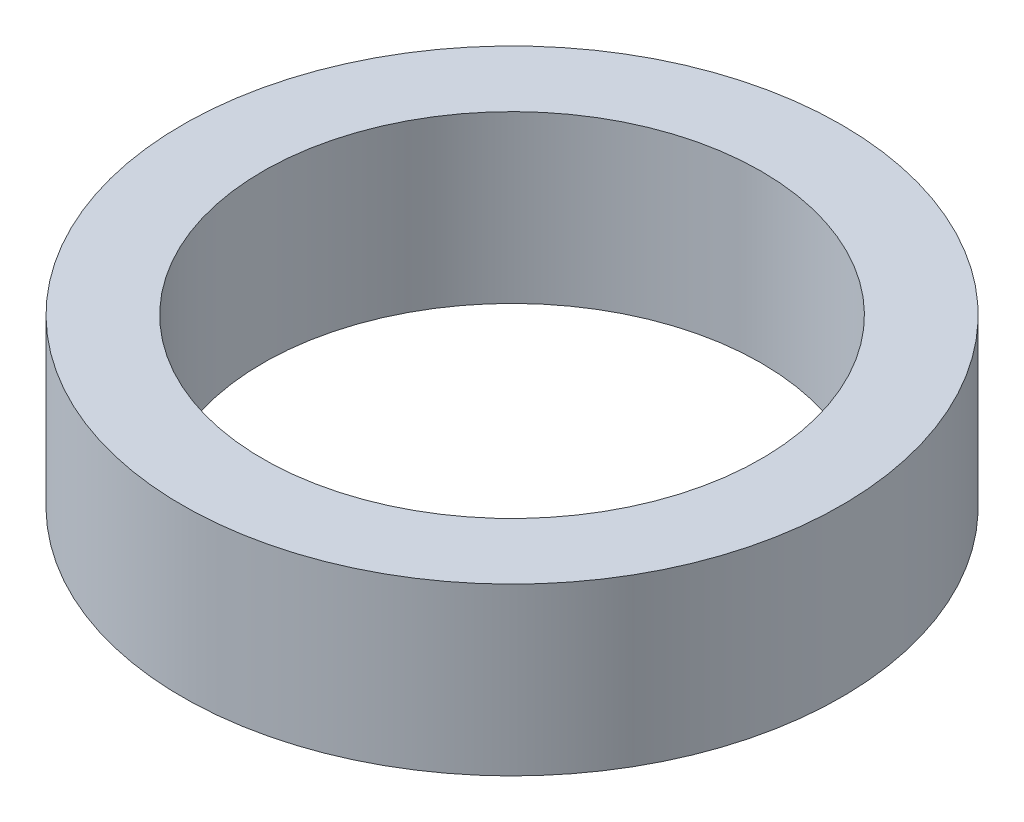
ISO-10303-21;
HEADER;
FILE_DESCRIPTION(('STEP AP214'),'2;1');
FILE_NAME('part.step','',(''),(''),'','','');
FILE_SCHEMA(('AUTOMOTIVE_DESIGN { 1 0 10303 214 1 1 1 1 }'));
ENDSEC;
DATA;
#1=APPLICATION_CONTEXT('core data for automotive mechanical design processes');
#2=APPLICATION_PROTOCOL_DEFINITION('international standard','automotive_design',2000,#1);
#3=PRODUCT_CONTEXT('',#1,'mechanical');
#4=PRODUCT('Part','Part','',(#3));
#5=PRODUCT_RELATED_PRODUCT_CATEGORY('part','',(#4));
#6=PRODUCT_DEFINITION_FORMATION('','',#4);
#7=PRODUCT_DEFINITION_CONTEXT('part definition',#1,'design');
#8=PRODUCT_DEFINITION('design','',#6,#7);
#9=PRODUCT_DEFINITION_SHAPE('','',#8);
#10=(LENGTH_UNIT() NAMED_UNIT(*) SI_UNIT(.MILLI.,.METRE.));
#11=(NAMED_UNIT(*) PLANE_ANGLE_UNIT() SI_UNIT($,.RADIAN.));
#12=(NAMED_UNIT(*) SI_UNIT($,.STERADIAN.) SOLID_ANGLE_UNIT());
#13=UNCERTAINTY_MEASURE_WITH_UNIT(LENGTH_MEASURE(1.E-05),#10,'distance_accuracy_value','');
#14=(GEOMETRIC_REPRESENTATION_CONTEXT(3) GLOBAL_UNCERTAINTY_ASSIGNED_CONTEXT((#13)) GLOBAL_UNIT_ASSIGNED_CONTEXT((#10,
#11,#12)) REPRESENTATION_CONTEXT('',''));
#15=CARTESIAN_POINT('',(0.,0.,0.));
#16=DIRECTION('',(0.,0.,1.));
#17=DIRECTION('',(1.,0.,0.));
#18=AXIS2_PLACEMENT_3D('',#15,#16,#17);
#19=CARTESIAN_POINT('',(-3.1496,1.5875,0.));
#20=DIRECTION('',(0.,-1.,0.));
#21=DIRECTION('',(0.,0.,-1.));
#22=AXIS2_PLACEMENT_3D('',#19,#20,#21);
#23=PLANE('',#22);
#24=CARTESIAN_POINT('',(0.,1.5875,0.));
#25=DIRECTION('',(0.,-1.,0.));
#26=DIRECTION('',(0.,0.,-1.));
#27=AXIS2_PLACEMENT_3D('',#24,#25,#26);
#28=CIRCLE('',#27,3.1496);
#29=CARTESIAN_POINT('',(0.,1.5875,-3.1496));
#30=VERTEX_POINT('',#29);
#31=EDGE_CURVE('E54',#30,#30,#28,.T.);
#32=ORIENTED_EDGE('',*,*,#31,.F.);
#33=EDGE_LOOP('',(#32));
#34=FACE_BOUND('',#33,.T.);
#35=CARTESIAN_POINT('',(0.,1.5875,0.));
#36=DIRECTION('',(0.,-1.,0.));
#37=DIRECTION('',(0.,0.,-1.));
#38=AXIS2_PLACEMENT_3D('',#35,#36,#37);
#39=CIRCLE('',#38,2.38125);
#40=CARTESIAN_POINT('',(0.,1.5875,-2.38125));
#41=VERTEX_POINT('',#40);
#42=EDGE_CURVE('E10',#41,#41,#39,.T.);
#43=ORIENTED_EDGE('',*,*,#42,.T.);
#44=EDGE_LOOP('',(#43));
#45=FACE_BOUND('',#44,.T.);
#46=ADVANCED_FACE('F37',(#34,#45),#23,.F.);
#47=CARTESIAN_POINT('',(0.,0.,0.));
#48=DIRECTION('',(0.,-1.,0.));
#49=DIRECTION('',(0.,0.,-1.));
#50=AXIS2_PLACEMENT_3D('',#47,#48,#49);
#51=CYLINDRICAL_SURFACE('',#50,2.38125);
#52=ORIENTED_EDGE('',*,*,#42,.F.);
#53=EDGE_LOOP('',(#52));
#54=FACE_BOUND('',#53,.T.);
#55=CARTESIAN_POINT('',(0.,0.,0.));
#56=DIRECTION('',(0.,-1.,0.));
#57=DIRECTION('',(0.,0.,-1.));
#58=AXIS2_PLACEMENT_3D('',#55,#56,#57);
#59=CIRCLE('',#58,2.38125);
#60=CARTESIAN_POINT('',(0.,0.,-2.38125));
#61=VERTEX_POINT('',#60);
#62=EDGE_CURVE('E44',#61,#61,#59,.T.);
#63=ORIENTED_EDGE('',*,*,#62,.T.);
#64=EDGE_LOOP('',(#63));
#65=FACE_BOUND('',#64,.T.);
#66=ADVANCED_FACE('F64',(#54,#65),#51,.F.);
#67=CARTESIAN_POINT('',(-2.38125,0.,0.));
#68=DIRECTION('',(0.,1.,0.));
#69=DIRECTION('',(0.,0.,1.));
#70=AXIS2_PLACEMENT_3D('',#67,#68,#69);
#71=PLANE('',#70);
#72=ORIENTED_EDGE('',*,*,#62,.F.);
#73=EDGE_LOOP('',(#72));
#74=FACE_BOUND('',#73,.T.);
#75=CARTESIAN_POINT('',(0.,0.,0.));
#76=DIRECTION('',(0.,-1.,0.));
#77=DIRECTION('',(0.,0.,-1.));
#78=AXIS2_PLACEMENT_3D('',#75,#76,#77);
#79=CIRCLE('',#78,3.1496);
#80=CARTESIAN_POINT('',(0.,0.,-3.1496));
#81=VERTEX_POINT('',#80);
#82=EDGE_CURVE('E49',#81,#81,#79,.T.);
#83=ORIENTED_EDGE('',*,*,#82,.T.);
#84=EDGE_LOOP('',(#83));
#85=FACE_BOUND('',#84,.T.);
#86=ADVANCED_FACE('F68',(#74,#85),#71,.F.);
#87=CARTESIAN_POINT('',(0.,0.,0.));
#88=DIRECTION('',(0.,-1.,0.));
#89=DIRECTION('',(0.,0.,-1.));
#90=AXIS2_PLACEMENT_3D('',#87,#88,#89);
#91=CYLINDRICAL_SURFACE('',#90,3.1496);
#92=ORIENTED_EDGE('',*,*,#82,.F.);
#93=EDGE_LOOP('',(#92));
#94=FACE_BOUND('',#93,.T.);
#95=ORIENTED_EDGE('',*,*,#31,.T.);
#96=EDGE_LOOP('',(#95));
#97=FACE_BOUND('',#96,.T.);
#98=ADVANCED_FACE('F61',(#94,#97),#91,.T.);
#99=CLOSED_SHELL('',(#46,#66,#86,#98));
#100=MANIFOLD_SOLID_BREP('B2',#99);
#101=ADVANCED_BREP_SHAPE_REPRESENTATION('',(#18,#100),#14);
#102=SHAPE_DEFINITION_REPRESENTATION(#9,#101);
ENDSEC;
END-ISO-10303-21;
